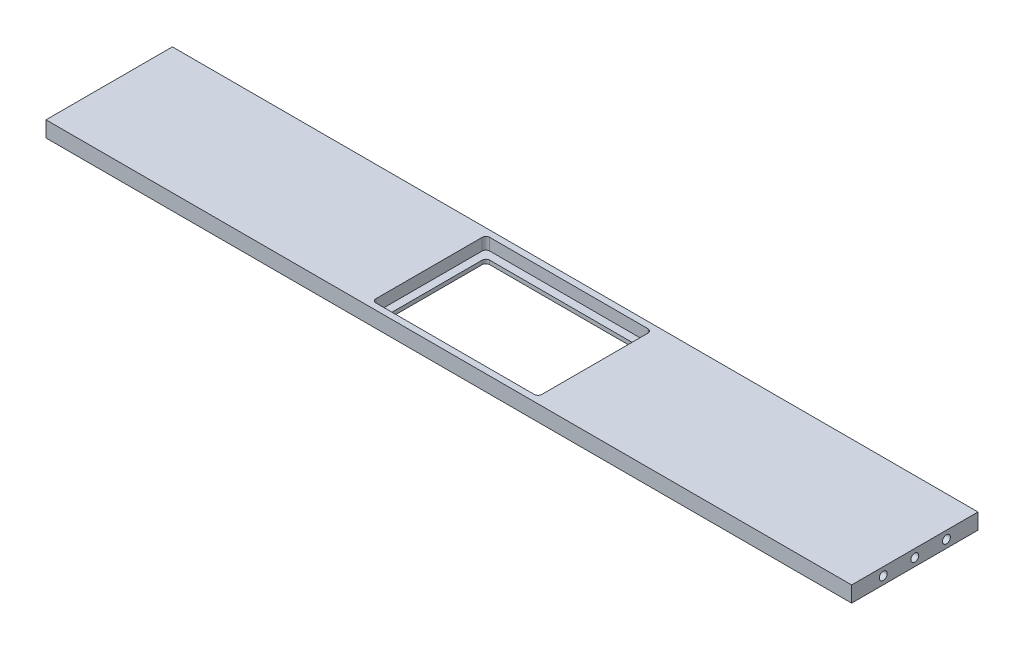
ISO-10303-21;
HEADER;
FILE_DESCRIPTION(('STEP AP214'),'2;1');
FILE_NAME('part.step','',(''),(''),'','','');
FILE_SCHEMA(('AUTOMOTIVE_DESIGN { 1 0 10303 214 1 1 1 1 }'));
ENDSEC;
DATA;
#1=APPLICATION_CONTEXT('core data for automotive mechanical design processes');
#2=APPLICATION_PROTOCOL_DEFINITION('international standard','automotive_design',2000,#1);
#3=PRODUCT_CONTEXT('',#1,'mechanical');
#4=PRODUCT('Part','Part','',(#3));
#5=PRODUCT_RELATED_PRODUCT_CATEGORY('part','',(#4));
#6=PRODUCT_DEFINITION_FORMATION('','',#4);
#7=PRODUCT_DEFINITION_CONTEXT('part definition',#1,'design');
#8=PRODUCT_DEFINITION('design','',#6,#7);
#9=PRODUCT_DEFINITION_SHAPE('','',#8);
#10=(LENGTH_UNIT() NAMED_UNIT(*) SI_UNIT(.MILLI.,.METRE.));
#11=(NAMED_UNIT(*) PLANE_ANGLE_UNIT() SI_UNIT($,.RADIAN.));
#12=(NAMED_UNIT(*) SI_UNIT($,.STERADIAN.) SOLID_ANGLE_UNIT());
#13=UNCERTAINTY_MEASURE_WITH_UNIT(LENGTH_MEASURE(1.E-05),#10,'distance_accuracy_value','');
#14=(GEOMETRIC_REPRESENTATION_CONTEXT(3) GLOBAL_UNCERTAINTY_ASSIGNED_CONTEXT((#13)) GLOBAL_UNIT_ASSIGNED_CONTEXT((#10,
#11,#12)) REPRESENTATION_CONTEXT('',''));
#15=CARTESIAN_POINT('',(0.,0.,0.));
#16=DIRECTION('',(0.,0.,1.));
#17=DIRECTION('',(1.,0.,0.));
#18=AXIS2_PLACEMENT_3D('',#15,#16,#17);
#19=CARTESIAN_POINT('',(-323.85,-12.7,50.8));
#20=DIRECTION('',(0.,1.,0.));
#21=DIRECTION('',(0.,0.,1.));
#22=AXIS2_PLACEMENT_3D('',#19,#20,#21);
#23=PLANE('',#22);
#24=DIRECTION('',(1.,0.,0.));
#25=VECTOR('',#24,1.);
#26=CARTESIAN_POINT('',(-323.85,-12.7,-50.8));
#27=LINE('',#26,#25);
#28=CARTESIAN_POINT('',(-323.85,-12.7,-50.8));
#29=VERTEX_POINT('',#28);
#30=CARTESIAN_POINT('',(323.85,-12.7,-50.8));
#31=VERTEX_POINT('',#30);
#32=EDGE_CURVE('E294',#29,#31,#27,.T.);
#33=ORIENTED_EDGE('',*,*,#32,.T.);
#34=DIRECTION('',(0.,0.,-1.));
#35=VECTOR('',#34,1.);
#36=CARTESIAN_POINT('',(323.85,-12.7,50.8));
#37=LINE('',#36,#35);
#38=CARTESIAN_POINT('',(323.85,-12.7,50.8));
#39=VERTEX_POINT('',#38);
#40=EDGE_CURVE('E363',#39,#31,#37,.T.);
#41=ORIENTED_EDGE('',*,*,#40,.F.);
#42=DIRECTION('',(1.,0.,0.));
#43=VECTOR('',#42,1.);
#44=CARTESIAN_POINT('',(-323.85,-12.7,50.8));
#45=LINE('',#44,#43);
#46=CARTESIAN_POINT('',(-323.85,-12.7,50.8));
#47=VERTEX_POINT('',#46);
#48=EDGE_CURVE('E337',#47,#39,#45,.T.);
#49=ORIENTED_EDGE('',*,*,#48,.F.);
#50=DIRECTION('',(0.,0.,-1.));
#51=VECTOR('',#50,1.);
#52=CARTESIAN_POINT('',(-323.85,-12.7,50.8));
#53=LINE('',#52,#51);
#54=EDGE_CURVE('E347',#47,#29,#53,.T.);
#55=ORIENTED_EDGE('',*,*,#54,.T.);
#56=EDGE_LOOP('',(#33,#41,#49,#55));
#57=FACE_BOUND('',#56,.T.);
#58=CARTESIAN_POINT('',(57.325,-12.7,36.37));
#59=DIRECTION('',(0.,-1.,0.));
#60=DIRECTION('',(0.,0.,-1.));
#61=AXIS2_PLACEMENT_3D('',#58,#59,#60);
#62=CIRCLE('',#61,3.);
#63=CARTESIAN_POINT('',(60.325,-12.7,36.37));
#64=VERTEX_POINT('',#63);
#65=CARTESIAN_POINT('',(57.325,-12.7,39.37));
#66=VERTEX_POINT('',#65);
#67=EDGE_CURVE('E188',#64,#66,#62,.T.);
#68=ORIENTED_EDGE('',*,*,#67,.F.);
#69=DIRECTION('',(0.,0.,1.));
#70=VECTOR('',#69,1.);
#71=CARTESIAN_POINT('',(60.325,-12.7,-36.37));
#72=LINE('',#71,#70);
#73=CARTESIAN_POINT('',(60.325,-12.7,-36.37));
#74=VERTEX_POINT('',#73);
#75=EDGE_CURVE('E221',#74,#64,#72,.T.);
#76=ORIENTED_EDGE('',*,*,#75,.F.);
#77=CARTESIAN_POINT('',(57.325,-12.7,-36.37));
#78=DIRECTION('',(0.,-1.,0.));
#79=DIRECTION('',(0.,0.,-1.));
#80=AXIS2_PLACEMENT_3D('',#77,#78,#79);
#81=CIRCLE('',#80,3.);
#82=CARTESIAN_POINT('',(57.325,-12.7,-39.37));
#83=VERTEX_POINT('',#82);
#84=EDGE_CURVE('E219',#83,#74,#81,.T.);
#85=ORIENTED_EDGE('',*,*,#84,.F.);
#86=DIRECTION('',(-1.,0.,0.));
#87=VECTOR('',#86,1.);
#88=CARTESIAN_POINT('',(57.325,-12.7,-39.37));
#89=LINE('',#88,#87);
#90=CARTESIAN_POINT('',(-57.325,-12.7,-39.37));
#91=VERTEX_POINT('',#90);
#92=EDGE_CURVE('E216',#83,#91,#89,.T.);
#93=ORIENTED_EDGE('',*,*,#92,.T.);
#94=CARTESIAN_POINT('',(-57.325,-12.7,-36.37));
#95=DIRECTION('',(0.,1.,0.));
#96=DIRECTION('',(0.,0.,1.));
#97=AXIS2_PLACEMENT_3D('',#94,#95,#96);
#98=CIRCLE('',#97,3.00000000000001);
#99=CARTESIAN_POINT('',(-60.325,-12.7,-36.37));
#100=VERTEX_POINT('',#99);
#101=EDGE_CURVE('E213',#91,#100,#98,.T.);
#102=ORIENTED_EDGE('',*,*,#101,.T.);
#103=DIRECTION('',(0.,0.,1.));
#104=VECTOR('',#103,1.);
#105=CARTESIAN_POINT('',(-60.325,-12.7,-36.37));
#106=LINE('',#105,#104);
#107=CARTESIAN_POINT('',(-60.325,-12.7,36.37));
#108=VERTEX_POINT('',#107);
#109=EDGE_CURVE('E209',#100,#108,#106,.T.);
#110=ORIENTED_EDGE('',*,*,#109,.T.);
#111=CARTESIAN_POINT('',(-57.325,-12.7,36.37));
#112=DIRECTION('',(0.,-1.,0.));
#113=DIRECTION('',(0.,0.,-1.));
#114=AXIS2_PLACEMENT_3D('',#111,#112,#113);
#115=CIRCLE('',#114,3.00000000000001);
#116=CARTESIAN_POINT('',(-57.325,-12.7,39.37));
#117=VERTEX_POINT('',#116);
#118=EDGE_CURVE('E207',#117,#108,#115,.T.);
#119=ORIENTED_EDGE('',*,*,#118,.F.);
#120=DIRECTION('',(-1.,0.,0.));
#121=VECTOR('',#120,1.);
#122=CARTESIAN_POINT('',(57.325,-12.7,39.37));
#123=LINE('',#122,#121);
#124=EDGE_CURVE('E195',#66,#117,#123,.T.);
#125=ORIENTED_EDGE('',*,*,#124,.F.);
#126=EDGE_LOOP('',(#68,#76,#85,#93,#102,#110,#119,#125));
#127=FACE_BOUND('',#126,.T.);
#128=ADVANCED_FACE('F35',(#57,#127),#23,.F.);
#129=CARTESIAN_POINT('',(-323.85,-9.52500000000004,50.8));
#130=DIRECTION('',(0.,1.,0.));
#131=DIRECTION('',(0.,0.,1.));
#132=AXIS2_PLACEMENT_3D('',#129,#130,#131);
#133=PLANE('',#132);
#134=DIRECTION('',(1.,0.,0.));
#135=VECTOR('',#134,1.);
#136=CARTESIAN_POINT('',(63.675,-9.52500000000003,45.72));
#137=LINE('',#136,#135);
#138=CARTESIAN_POINT('',(-63.675,-9.52500000000003,45.72));
#139=VERTEX_POINT('',#138);
#140=CARTESIAN_POINT('',(63.675,-9.52500000000003,45.72));
#141=VERTEX_POINT('',#140);
#142=EDGE_CURVE('E288',#139,#141,#137,.T.);
#143=ORIENTED_EDGE('',*,*,#142,.T.);
#144=CARTESIAN_POINT('',(63.675,-9.52500000000003,42.72));
#145=DIRECTION('',(0.,1.,0.));
#146=DIRECTION('',(0.,0.,1.));
#147=AXIS2_PLACEMENT_3D('',#144,#145,#146);
#148=CIRCLE('',#147,3.00000000000001);
#149=CARTESIAN_POINT('',(66.675,-9.52500000000003,42.72));
#150=VERTEX_POINT('',#149);
#151=EDGE_CURVE('E291',#141,#150,#148,.T.);
#152=ORIENTED_EDGE('',*,*,#151,.T.);
#153=DIRECTION('',(0.,0.,-1.));
#154=VECTOR('',#153,1.);
#155=CARTESIAN_POINT('',(66.675,-9.52500000000003,-42.72));
#156=LINE('',#155,#154);
#157=CARTESIAN_POINT('',(66.675,-9.52500000000003,-42.72));
#158=VERTEX_POINT('',#157);
#159=EDGE_CURVE('E278',#150,#158,#156,.T.);
#160=ORIENTED_EDGE('',*,*,#159,.T.);
#161=CARTESIAN_POINT('',(63.675,-9.52500000000003,-42.72));
#162=DIRECTION('',(0.,1.,0.));
#163=DIRECTION('',(0.,0.,1.));
#164=AXIS2_PLACEMENT_3D('',#161,#162,#163);
#165=CIRCLE('',#164,3.);
#166=CARTESIAN_POINT('',(63.675,-9.52500000000003,-45.72));
#167=VERTEX_POINT('',#166);
#168=EDGE_CURVE('E274',#158,#167,#165,.T.);
#169=ORIENTED_EDGE('',*,*,#168,.T.);
#170=DIRECTION('',(1.,0.,0.));
#171=VECTOR('',#170,1.);
#172=CARTESIAN_POINT('',(63.675,-9.52500000000003,-45.72));
#173=LINE('',#172,#171);
#174=CARTESIAN_POINT('',(-63.675,-9.52500000000003,-45.72));
#175=VERTEX_POINT('',#174);
#176=EDGE_CURVE('E277',#175,#167,#173,.T.);
#177=ORIENTED_EDGE('',*,*,#176,.F.);
#178=CARTESIAN_POINT('',(-63.675,-9.52500000000003,-42.72));
#179=DIRECTION('',(0.,1.,0.));
#180=DIRECTION('',(0.,0.,1.));
#181=AXIS2_PLACEMENT_3D('',#178,#179,#180);
#182=CIRCLE('',#181,3.);
#183=CARTESIAN_POINT('',(-66.675,-9.52500000000003,-42.72));
#184=VERTEX_POINT('',#183);
#185=EDGE_CURVE('E280',#175,#184,#182,.T.);
#186=ORIENTED_EDGE('',*,*,#185,.T.);
#187=DIRECTION('',(0.,0.,-1.));
#188=VECTOR('',#187,1.);
#189=CARTESIAN_POINT('',(-66.675,-9.52500000000003,-42.72));
#190=LINE('',#189,#188);
#191=CARTESIAN_POINT('',(-66.675,-9.52500000000003,42.72));
#192=VERTEX_POINT('',#191);
#193=EDGE_CURVE('E283',#192,#184,#190,.T.);
#194=ORIENTED_EDGE('',*,*,#193,.F.);
#195=CARTESIAN_POINT('',(-63.675,-9.52500000000003,42.72));
#196=DIRECTION('',(0.,1.,0.));
#197=DIRECTION('',(0.,0.,1.));
#198=AXIS2_PLACEMENT_3D('',#195,#196,#197);
#199=CIRCLE('',#198,3.);
#200=EDGE_CURVE('E285',#192,#139,#199,.T.);
#201=ORIENTED_EDGE('',*,*,#200,.T.);
#202=EDGE_LOOP('',(#143,#152,#160,#169,#177,#186,#194,#201));
#203=FACE_BOUND('',#202,.T.);
#204=DIRECTION('',(0.,0.,1.));
#205=VECTOR('',#204,1.);
#206=CARTESIAN_POINT('',(60.325,-9.52500000000004,50.8000000000001));
#207=LINE('',#206,#205);
#208=CARTESIAN_POINT('',(60.325,-9.52500000000004,-36.37));
#209=VERTEX_POINT('',#208);
#210=CARTESIAN_POINT('',(60.325,-9.52500000000004,36.37));
#211=VERTEX_POINT('',#210);
#212=EDGE_CURVE('E366',#209,#211,#207,.T.);
#213=ORIENTED_EDGE('',*,*,#212,.T.);
#214=CARTESIAN_POINT('',(57.325,-9.52500000000004,36.37));
#215=DIRECTION('',(0.,1.,0.));
#216=DIRECTION('',(0.,0.,1.));
#217=AXIS2_PLACEMENT_3D('',#214,#215,#216);
#218=CIRCLE('',#217,3.);
#219=CARTESIAN_POINT('',(57.325,-9.52500000000004,39.37));
#220=VERTEX_POINT('',#219);
#221=EDGE_CURVE('E12',#211,#220,#218,.F.);
#222=ORIENTED_EDGE('',*,*,#221,.T.);
#223=DIRECTION('',(-1.,0.,0.));
#224=VECTOR('',#223,1.);
#225=CARTESIAN_POINT('',(-323.85,-9.52500000000004,39.37));
#226=LINE('',#225,#224);
#227=CARTESIAN_POINT('',(-57.325,-9.52500000000004,39.37));
#228=VERTEX_POINT('',#227);
#229=EDGE_CURVE('E42',#220,#228,#226,.T.);
#230=ORIENTED_EDGE('',*,*,#229,.T.);
#231=CARTESIAN_POINT('',(-57.325,-9.52500000000004,36.37));
#232=DIRECTION('',(0.,1.,0.));
#233=DIRECTION('',(0.,0.,1.));
#234=AXIS2_PLACEMENT_3D('',#231,#232,#233);
#235=CIRCLE('',#234,3.00000000000001);
#236=CARTESIAN_POINT('',(-60.325,-9.52500000000004,36.37));
#237=VERTEX_POINT('',#236);
#238=EDGE_CURVE('E378',#228,#237,#235,.F.);
#239=ORIENTED_EDGE('',*,*,#238,.T.);
#240=DIRECTION('',(0.,0.,1.));
#241=VECTOR('',#240,1.);
#242=CARTESIAN_POINT('',(-60.325,-9.52500000000004,50.8));
#243=LINE('',#242,#241);
#244=CARTESIAN_POINT('',(-60.325,-9.52500000000004,-36.37));
#245=VERTEX_POINT('',#244);
#246=EDGE_CURVE('E376',#245,#237,#243,.T.);
#247=ORIENTED_EDGE('',*,*,#246,.F.);
#248=CARTESIAN_POINT('',(-57.325,-9.52500000000004,-36.37));
#249=DIRECTION('',(0.,1.,0.));
#250=DIRECTION('',(0.,0.,1.));
#251=AXIS2_PLACEMENT_3D('',#248,#249,#250);
#252=CIRCLE('',#251,3.00000000000001);
#253=CARTESIAN_POINT('',(-57.325,-9.52500000000004,-39.37));
#254=VERTEX_POINT('',#253);
#255=EDGE_CURVE('E374',#254,#245,#252,.T.);
#256=ORIENTED_EDGE('',*,*,#255,.F.);
#257=DIRECTION('',(-1.,0.,0.));
#258=VECTOR('',#257,1.);
#259=CARTESIAN_POINT('',(-323.85,-9.52500000000004,-39.37));
#260=LINE('',#259,#258);
#261=CARTESIAN_POINT('',(57.325,-9.52500000000004,-39.37));
#262=VERTEX_POINT('',#261);
#263=EDGE_CURVE('E372',#262,#254,#260,.T.);
#264=ORIENTED_EDGE('',*,*,#263,.F.);
#265=CARTESIAN_POINT('',(57.325,-9.52500000000004,-36.37));
#266=DIRECTION('',(0.,1.,0.));
#267=DIRECTION('',(0.,0.,1.));
#268=AXIS2_PLACEMENT_3D('',#265,#266,#267);
#269=CIRCLE('',#268,3.);
#270=EDGE_CURVE('E369',#262,#209,#269,.F.);
#271=ORIENTED_EDGE('',*,*,#270,.T.);
#272=EDGE_LOOP('',(#213,#222,#230,#239,#247,#256,#264,#271));
#273=FACE_BOUND('',#272,.T.);
#274=ADVANCED_FACE('F381',(#203,#273),#133,.T.);
#275=CARTESIAN_POINT('',(323.85,-12.7,50.8));
#276=DIRECTION('',(-1.,0.,0.));
#277=DIRECTION('',(0.,0.,1.));
#278=AXIS2_PLACEMENT_3D('',#275,#276,#277);
#279=PLANE('',#278);
#280=CARTESIAN_POINT('',(323.85,-6.35000000000002,-25.4));
#281=DIRECTION('',(1.,0.,0.));
#282=DIRECTION('',(0.,0.,-1.));
#283=AXIS2_PLACEMENT_3D('',#280,#281,#282);
#284=CIRCLE('',#283,3.17499999999999);
#285=CARTESIAN_POINT('',(323.85,-6.35000000000002,-28.575));
#286=VERTEX_POINT('',#285);
#287=EDGE_CURVE('E202',#286,#286,#284,.T.);
#288=ORIENTED_EDGE('',*,*,#287,.F.);
#289=EDGE_LOOP('',(#288));
#290=FACE_BOUND('',#289,.T.);
#291=CARTESIAN_POINT('',(323.85,-6.35000000000002,0.));
#292=DIRECTION('',(1.,0.,0.));
#293=DIRECTION('',(0.,0.,-1.));
#294=AXIS2_PLACEMENT_3D('',#291,#292,#293);
#295=CIRCLE('',#294,3.17499999999999);
#296=CARTESIAN_POINT('',(323.85,-6.35000000000002,-3.17499999999999));
#297=VERTEX_POINT('',#296);
#298=EDGE_CURVE('E243',#297,#297,#295,.T.);
#299=ORIENTED_EDGE('',*,*,#298,.F.);
#300=EDGE_LOOP('',(#299));
#301=FACE_BOUND('',#300,.T.);
#302=CARTESIAN_POINT('',(323.85,-6.35000000000002,25.4));
#303=DIRECTION('',(1.,0.,0.));
#304=DIRECTION('',(0.,0.,-1.));
#305=AXIS2_PLACEMENT_3D('',#302,#303,#304);
#306=CIRCLE('',#305,3.17499999999999);
#307=CARTESIAN_POINT('',(323.85,-6.35000000000002,22.225));
#308=VERTEX_POINT('',#307);
#309=EDGE_CURVE('E249',#308,#308,#306,.T.);
#310=ORIENTED_EDGE('',*,*,#309,.F.);
#311=EDGE_LOOP('',(#310));
#312=FACE_BOUND('',#311,.T.);
#313=DIRECTION('',(0.,1.,0.));
#314=VECTOR('',#313,1.);
#315=CARTESIAN_POINT('',(323.85,-12.7,-50.8));
#316=LINE('',#315,#314);
#317=CARTESIAN_POINT('',(323.85,0.,-50.8));
#318=VERTEX_POINT('',#317);
#319=EDGE_CURVE('E350',#31,#318,#316,.T.);
#320=ORIENTED_EDGE('',*,*,#319,.T.);
#321=DIRECTION('',(0.,0.,-1.));
#322=VECTOR('',#321,1.);
#323=CARTESIAN_POINT('',(323.85,0.,50.8));
#324=LINE('',#323,#322);
#325=CARTESIAN_POINT('',(323.85,0.,50.8));
#326=VERTEX_POINT('',#325);
#327=EDGE_CURVE('E360',#326,#318,#324,.T.);
#328=ORIENTED_EDGE('',*,*,#327,.F.);
#329=DIRECTION('',(0.,1.,0.));
#330=VECTOR('',#329,1.);
#331=CARTESIAN_POINT('',(323.85,-12.7,50.8));
#332=LINE('',#331,#330);
#333=EDGE_CURVE('E340',#39,#326,#332,.T.);
#334=ORIENTED_EDGE('',*,*,#333,.F.);
#335=ORIENTED_EDGE('',*,*,#40,.T.);
#336=EDGE_LOOP('',(#320,#328,#334,#335));
#337=FACE_BOUND('',#336,.T.);
#338=ADVANCED_FACE('F414',(#290,#301,#312,#337),#279,.F.);
#339=CARTESIAN_POINT('',(-323.85,0.,50.8));
#340=DIRECTION('',(0.,-1.,0.));
#341=DIRECTION('',(0.,0.,-1.));
#342=AXIS2_PLACEMENT_3D('',#339,#340,#341);
#343=PLANE('',#342);
#344=DIRECTION('',(0.,0.,1.));
#345=VECTOR('',#344,1.);
#346=CARTESIAN_POINT('',(66.675,0.,-42.72));
#347=LINE('',#346,#345);
#348=CARTESIAN_POINT('',(66.675,0.,-42.72));
#349=VERTEX_POINT('',#348);
#350=CARTESIAN_POINT('',(66.675,0.,42.72));
#351=VERTEX_POINT('',#350);
#352=EDGE_CURVE('E315',#349,#351,#347,.T.);
#353=ORIENTED_EDGE('',*,*,#352,.T.);
#354=CARTESIAN_POINT('',(63.675,0.,42.72));
#355=DIRECTION('',(0.,-1.,0.));
#356=DIRECTION('',(0.,0.,-1.));
#357=AXIS2_PLACEMENT_3D('',#354,#355,#356);
#358=CIRCLE('',#357,3.00000000000001);
#359=CARTESIAN_POINT('',(63.675,0.,45.72));
#360=VERTEX_POINT('',#359);
#361=EDGE_CURVE('E273',#351,#360,#358,.T.);
#362=ORIENTED_EDGE('',*,*,#361,.T.);
#363=DIRECTION('',(-1.,0.,0.));
#364=VECTOR('',#363,1.);
#365=CARTESIAN_POINT('',(63.675,0.,45.72));
#366=LINE('',#365,#364);
#367=CARTESIAN_POINT('',(-63.675,0.,45.72));
#368=VERTEX_POINT('',#367);
#369=EDGE_CURVE('E297',#360,#368,#366,.T.);
#370=ORIENTED_EDGE('',*,*,#369,.T.);
#371=CARTESIAN_POINT('',(-63.675,0.,42.72));
#372=DIRECTION('',(0.,-1.,0.));
#373=DIRECTION('',(0.,0.,-1.));
#374=AXIS2_PLACEMENT_3D('',#371,#372,#373);
#375=CIRCLE('',#374,3.);
#376=CARTESIAN_POINT('',(-66.675,0.,42.72));
#377=VERTEX_POINT('',#376);
#378=EDGE_CURVE('E300',#368,#377,#375,.T.);
#379=ORIENTED_EDGE('',*,*,#378,.T.);
#380=DIRECTION('',(0.,0.,1.));
#381=VECTOR('',#380,1.);
#382=CARTESIAN_POINT('',(-66.675,0.,-42.72));
#383=LINE('',#382,#381);
#384=CARTESIAN_POINT('',(-66.675,0.,-42.72));
#385=VERTEX_POINT('',#384);
#386=EDGE_CURVE('E303',#385,#377,#383,.T.);
#387=ORIENTED_EDGE('',*,*,#386,.F.);
#388=CARTESIAN_POINT('',(-63.675,0.,-42.72));
#389=DIRECTION('',(0.,-1.,0.));
#390=DIRECTION('',(0.,0.,-1.));
#391=AXIS2_PLACEMENT_3D('',#388,#389,#390);
#392=CIRCLE('',#391,3.);
#393=CARTESIAN_POINT('',(-63.675,0.,-45.72));
#394=VERTEX_POINT('',#393);
#395=EDGE_CURVE('E306',#385,#394,#392,.T.);
#396=ORIENTED_EDGE('',*,*,#395,.T.);
#397=DIRECTION('',(-1.,0.,0.));
#398=VECTOR('',#397,1.);
#399=CARTESIAN_POINT('',(63.675,0.,-45.72));
#400=LINE('',#399,#398);
#401=CARTESIAN_POINT('',(63.675,0.,-45.72));
#402=VERTEX_POINT('',#401);
#403=EDGE_CURVE('E309',#402,#394,#400,.T.);
#404=ORIENTED_EDGE('',*,*,#403,.F.);
#405=CARTESIAN_POINT('',(63.675,0.,-42.72));
#406=DIRECTION('',(0.,-1.,0.));
#407=DIRECTION('',(0.,0.,-1.));
#408=AXIS2_PLACEMENT_3D('',#405,#406,#407);
#409=CIRCLE('',#408,3.);
#410=EDGE_CURVE('E312',#402,#349,#409,.T.);
#411=ORIENTED_EDGE('',*,*,#410,.T.);
#412=EDGE_LOOP('',(#353,#362,#370,#379,#387,#396,#404,#411));
#413=FACE_BOUND('',#412,.T.);
#414=DIRECTION('',(-1.,0.,0.));
#415=VECTOR('',#414,1.);
#416=CARTESIAN_POINT('',(-323.85,0.,-50.8));
#417=LINE('',#416,#415);
#418=CARTESIAN_POINT('',(-323.85,0.,-50.8));
#419=VERTEX_POINT('',#418);
#420=EDGE_CURVE('E352',#318,#419,#417,.T.);
#421=ORIENTED_EDGE('',*,*,#420,.T.);
#422=DIRECTION('',(0.,0.,-1.));
#423=VECTOR('',#422,1.);
#424=CARTESIAN_POINT('',(-323.85,0.,50.8));
#425=LINE('',#424,#423);
#426=CARTESIAN_POINT('',(-323.85,0.,50.8));
#427=VERTEX_POINT('',#426);
#428=EDGE_CURVE('E357',#427,#419,#425,.T.);
#429=ORIENTED_EDGE('',*,*,#428,.F.);
#430=DIRECTION('',(-1.,0.,0.));
#431=VECTOR('',#430,1.);
#432=CARTESIAN_POINT('',(-323.85,0.,50.8));
#433=LINE('',#432,#431);
#434=EDGE_CURVE('E343',#326,#427,#433,.T.);
#435=ORIENTED_EDGE('',*,*,#434,.F.);
#436=ORIENTED_EDGE('',*,*,#327,.T.);
#437=EDGE_LOOP('',(#421,#429,#435,#436));
#438=FACE_BOUND('',#437,.T.);
#439=ADVANCED_FACE('F435',(#413,#438),#343,.F.);
#440=CARTESIAN_POINT('',(-323.85,-12.7,50.8));
#441=DIRECTION('',(1.,0.,0.));
#442=DIRECTION('',(0.,0.,-1.));
#443=AXIS2_PLACEMENT_3D('',#440,#441,#442);
#444=PLANE('',#443);
#445=CARTESIAN_POINT('',(-323.85,-6.35000000000002,-25.4));
#446=DIRECTION('',(-1.,0.,0.));
#447=DIRECTION('',(0.,0.,1.));
#448=AXIS2_PLACEMENT_3D('',#445,#446,#447);
#449=CIRCLE('',#448,3.17499999999999);
#450=CARTESIAN_POINT('',(-323.85,-6.35000000000002,-22.225));
#451=VERTEX_POINT('',#450);
#452=EDGE_CURVE('E255',#451,#451,#449,.T.);
#453=ORIENTED_EDGE('',*,*,#452,.F.);
#454=EDGE_LOOP('',(#453));
#455=FACE_BOUND('',#454,.T.);
#456=CARTESIAN_POINT('',(-323.85,-6.35000000000002,0.));
#457=DIRECTION('',(-1.,0.,0.));
#458=DIRECTION('',(0.,0.,1.));
#459=AXIS2_PLACEMENT_3D('',#456,#457,#458);
#460=CIRCLE('',#459,3.17499999999999);
#461=CARTESIAN_POINT('',(-323.85,-6.35000000000002,3.17499999999999));
#462=VERTEX_POINT('',#461);
#463=EDGE_CURVE('E261',#462,#462,#460,.T.);
#464=ORIENTED_EDGE('',*,*,#463,.F.);
#465=EDGE_LOOP('',(#464));
#466=FACE_BOUND('',#465,.T.);
#467=CARTESIAN_POINT('',(-323.85,-6.35000000000002,25.4));
#468=DIRECTION('',(-1.,0.,0.));
#469=DIRECTION('',(0.,0.,1.));
#470=AXIS2_PLACEMENT_3D('',#467,#468,#469);
#471=CIRCLE('',#470,3.17499999999999);
#472=CARTESIAN_POINT('',(-323.85,-6.35000000000002,28.575));
#473=VERTEX_POINT('',#472);
#474=EDGE_CURVE('E267',#473,#473,#471,.T.);
#475=ORIENTED_EDGE('',*,*,#474,.F.);
#476=EDGE_LOOP('',(#475));
#477=FACE_BOUND('',#476,.T.);
#478=DIRECTION('',(0.,-1.,0.));
#479=VECTOR('',#478,1.);
#480=CARTESIAN_POINT('',(-323.85,-12.7,-50.8));
#481=LINE('',#480,#479);
#482=EDGE_CURVE('E341',#419,#29,#481,.T.);
#483=ORIENTED_EDGE('',*,*,#482,.T.);
#484=ORIENTED_EDGE('',*,*,#54,.F.);
#485=DIRECTION('',(0.,-1.,0.));
#486=VECTOR('',#485,1.);
#487=CARTESIAN_POINT('',(-323.85,-12.7,50.8));
#488=LINE('',#487,#486);
#489=EDGE_CURVE('E345',#427,#47,#488,.T.);
#490=ORIENTED_EDGE('',*,*,#489,.F.);
#491=ORIENTED_EDGE('',*,*,#428,.T.);
#492=EDGE_LOOP('',(#483,#484,#490,#491));
#493=FACE_BOUND('',#492,.T.);
#494=ADVANCED_FACE('F433',(#455,#466,#477,#493),#444,.F.);
#495=CARTESIAN_POINT('',(0.,0.,50.8));
#496=DIRECTION('',(0.,0.,1.));
#497=DIRECTION('',(1.,0.,0.));
#498=AXIS2_PLACEMENT_3D('',#495,#496,#497);
#499=PLANE('',#498);
#500=ORIENTED_EDGE('',*,*,#48,.T.);
#501=ORIENTED_EDGE('',*,*,#333,.T.);
#502=ORIENTED_EDGE('',*,*,#434,.T.);
#503=ORIENTED_EDGE('',*,*,#489,.T.);
#504=EDGE_LOOP('',(#500,#501,#502,#503));
#505=FACE_BOUND('',#504,.T.);
#506=ADVANCED_FACE('F429',(#505),#499,.T.);
#507=CARTESIAN_POINT('',(0.,0.,-50.8));
#508=DIRECTION('',(0.,0.,1.));
#509=DIRECTION('',(1.,0.,0.));
#510=AXIS2_PLACEMENT_3D('',#507,#508,#509);
#511=PLANE('',#510);
#512=ORIENTED_EDGE('',*,*,#32,.F.);
#513=ORIENTED_EDGE('',*,*,#482,.F.);
#514=ORIENTED_EDGE('',*,*,#420,.F.);
#515=ORIENTED_EDGE('',*,*,#319,.F.);
#516=EDGE_LOOP('',(#512,#513,#514,#515));
#517=FACE_BOUND('',#516,.T.);
#518=ADVANCED_FACE('F423',(#517),#511,.F.);
#519=CARTESIAN_POINT('',(66.675,-174.389505225293,-42.72));
#520=DIRECTION('',(-1.,0.,0.));
#521=DIRECTION('',(0.,0.,1.));
#522=AXIS2_PLACEMENT_3D('',#519,#520,#521);
#523=PLANE('',#522);
#524=DIRECTION('',(0.,1.,0.));
#525=VECTOR('',#524,1.);
#526=CARTESIAN_POINT('',(66.675,-174.389505225293,42.72));
#527=LINE('',#526,#525);
#528=EDGE_CURVE('E318',#150,#351,#527,.T.);
#529=ORIENTED_EDGE('',*,*,#528,.T.);
#530=ORIENTED_EDGE('',*,*,#352,.F.);
#531=DIRECTION('',(0.,1.,0.));
#532=VECTOR('',#531,1.);
#533=CARTESIAN_POINT('',(66.675,-174.389505225293,-42.72));
#534=LINE('',#533,#532);
#535=EDGE_CURVE('E320',#158,#349,#534,.T.);
#536=ORIENTED_EDGE('',*,*,#535,.F.);
#537=ORIENTED_EDGE('',*,*,#159,.F.);
#538=EDGE_LOOP('',(#529,#530,#536,#537));
#539=FACE_BOUND('',#538,.T.);
#540=ADVANCED_FACE('F449',(#539),#523,.T.);
#541=CARTESIAN_POINT('',(63.675,-174.389505225293,-42.72));
#542=DIRECTION('',(0.,1.,0.));
#543=DIRECTION('',(0.,0.,1.));
#544=AXIS2_PLACEMENT_3D('',#541,#542,#543);
#545=CYLINDRICAL_SURFACE('',#544,3.);
#546=ORIENTED_EDGE('',*,*,#535,.T.);
#547=ORIENTED_EDGE('',*,*,#410,.F.);
#548=DIRECTION('',(0.,1.,0.));
#549=VECTOR('',#548,1.);
#550=CARTESIAN_POINT('',(63.675,-174.389505225293,-45.72));
#551=LINE('',#550,#549);
#552=EDGE_CURVE('E322',#167,#402,#551,.T.);
#553=ORIENTED_EDGE('',*,*,#552,.F.);
#554=ORIENTED_EDGE('',*,*,#168,.F.);
#555=EDGE_LOOP('',(#546,#547,#553,#554));
#556=FACE_BOUND('',#555,.T.);
#557=ADVANCED_FACE('F476',(#556),#545,.F.);
#558=CARTESIAN_POINT('',(63.675,-174.389505225293,-45.72));
#559=DIRECTION('',(0.,0.,-1.));
#560=DIRECTION('',(-1.,0.,0.));
#561=AXIS2_PLACEMENT_3D('',#558,#559,#560);
#562=PLANE('',#561);
#563=ORIENTED_EDGE('',*,*,#176,.T.);
#564=ORIENTED_EDGE('',*,*,#552,.T.);
#565=ORIENTED_EDGE('',*,*,#403,.T.);
#566=DIRECTION('',(0.,1.,0.));
#567=VECTOR('',#566,1.);
#568=CARTESIAN_POINT('',(-63.675,-174.389505225293,-45.72));
#569=LINE('',#568,#567);
#570=EDGE_CURVE('E324',#175,#394,#569,.T.);
#571=ORIENTED_EDGE('',*,*,#570,.F.);
#572=EDGE_LOOP('',(#563,#564,#565,#571));
#573=FACE_BOUND('',#572,.T.);
#574=ADVANCED_FACE('F472',(#573),#562,.F.);
#575=CARTESIAN_POINT('',(-63.675,-174.389505225293,-42.72));
#576=DIRECTION('',(0.,1.,0.));
#577=DIRECTION('',(0.,0.,1.));
#578=AXIS2_PLACEMENT_3D('',#575,#576,#577);
#579=CYLINDRICAL_SURFACE('',#578,3.);
#580=ORIENTED_EDGE('',*,*,#570,.T.);
#581=ORIENTED_EDGE('',*,*,#395,.F.);
#582=DIRECTION('',(0.,1.,0.));
#583=VECTOR('',#582,1.);
#584=CARTESIAN_POINT('',(-66.675,-174.389505225293,-42.72));
#585=LINE('',#584,#583);
#586=EDGE_CURVE('E326',#184,#385,#585,.T.);
#587=ORIENTED_EDGE('',*,*,#586,.F.);
#588=ORIENTED_EDGE('',*,*,#185,.F.);
#589=EDGE_LOOP('',(#580,#581,#587,#588));
#590=FACE_BOUND('',#589,.T.);
#591=ADVANCED_FACE('F468',(#590),#579,.F.);
#592=CARTESIAN_POINT('',(-66.675,-174.389505225293,-42.72));
#593=DIRECTION('',(-1.,0.,0.));
#594=DIRECTION('',(0.,0.,1.));
#595=AXIS2_PLACEMENT_3D('',#592,#593,#594);
#596=PLANE('',#595);
#597=ORIENTED_EDGE('',*,*,#193,.T.);
#598=ORIENTED_EDGE('',*,*,#586,.T.);
#599=ORIENTED_EDGE('',*,*,#386,.T.);
#600=DIRECTION('',(0.,1.,0.));
#601=VECTOR('',#600,1.);
#602=CARTESIAN_POINT('',(-66.675,-174.389505225293,42.72));
#603=LINE('',#602,#601);
#604=EDGE_CURVE('E328',#192,#377,#603,.T.);
#605=ORIENTED_EDGE('',*,*,#604,.F.);
#606=EDGE_LOOP('',(#597,#598,#599,#605));
#607=FACE_BOUND('',#606,.T.);
#608=ADVANCED_FACE('F464',(#607),#596,.F.);
#609=CARTESIAN_POINT('',(-63.675,-174.389505225293,42.72));
#610=DIRECTION('',(0.,1.,0.));
#611=DIRECTION('',(0.,0.,1.));
#612=AXIS2_PLACEMENT_3D('',#609,#610,#611);
#613=CYLINDRICAL_SURFACE('',#612,3.);
#614=ORIENTED_EDGE('',*,*,#604,.T.);
#615=ORIENTED_EDGE('',*,*,#378,.F.);
#616=DIRECTION('',(0.,1.,0.));
#617=VECTOR('',#616,1.);
#618=CARTESIAN_POINT('',(-63.675,-174.389505225293,45.72));
#619=LINE('',#618,#617);
#620=EDGE_CURVE('E330',#139,#368,#619,.T.);
#621=ORIENTED_EDGE('',*,*,#620,.F.);
#622=ORIENTED_EDGE('',*,*,#200,.F.);
#623=EDGE_LOOP('',(#614,#615,#621,#622));
#624=FACE_BOUND('',#623,.T.);
#625=ADVANCED_FACE('F460',(#624),#613,.F.);
#626=CARTESIAN_POINT('',(63.675,-174.389505225293,45.72));
#627=DIRECTION('',(0.,0.,-1.));
#628=DIRECTION('',(-1.,0.,0.));
#629=AXIS2_PLACEMENT_3D('',#626,#627,#628);
#630=PLANE('',#629);
#631=ORIENTED_EDGE('',*,*,#620,.T.);
#632=ORIENTED_EDGE('',*,*,#369,.F.);
#633=DIRECTION('',(0.,1.,0.));
#634=VECTOR('',#633,1.);
#635=CARTESIAN_POINT('',(63.675,-174.389505225293,45.72));
#636=LINE('',#635,#634);
#637=EDGE_CURVE('E332',#141,#360,#636,.T.);
#638=ORIENTED_EDGE('',*,*,#637,.F.);
#639=ORIENTED_EDGE('',*,*,#142,.F.);
#640=EDGE_LOOP('',(#631,#632,#638,#639));
#641=FACE_BOUND('',#640,.T.);
#642=ADVANCED_FACE('F456',(#641),#630,.T.);
#643=CARTESIAN_POINT('',(63.675,-174.389505225293,42.72));
#644=DIRECTION('',(0.,1.,0.));
#645=DIRECTION('',(0.,0.,1.));
#646=AXIS2_PLACEMENT_3D('',#643,#644,#645);
#647=CYLINDRICAL_SURFACE('',#646,3.00000000000001);
#648=ORIENTED_EDGE('',*,*,#637,.T.);
#649=ORIENTED_EDGE('',*,*,#361,.F.);
#650=ORIENTED_EDGE('',*,*,#528,.F.);
#651=ORIENTED_EDGE('',*,*,#151,.F.);
#652=EDGE_LOOP('',(#648,#649,#650,#651));
#653=FACE_BOUND('',#652,.T.);
#654=ADVANCED_FACE('F452',(#653),#647,.F.);
#655=CARTESIAN_POINT('',(-273.05,-6.35000000000002,25.4));
#656=DIRECTION('',(-1.,0.,0.));
#657=DIRECTION('',(0.,0.,1.));
#658=AXIS2_PLACEMENT_3D('',#655,#656,#657);
#659=CONICAL_SURFACE('',#658,3.17499999999999,1.02974425867666);
#660=CARTESIAN_POINT('',(-271.142267534587,-6.35000000000004,25.4));
#661=VERTEX_POINT('',#660);
#662=VERTEX_LOOP('',#661);
#663=FACE_BOUND('',#662,.T.);
#664=CARTESIAN_POINT('',(-273.05,-6.35000000000002,25.4));
#665=DIRECTION('',(-1.,0.,0.));
#666=DIRECTION('',(0.,0.,1.));
#667=AXIS2_PLACEMENT_3D('',#664,#665,#666);
#668=CIRCLE('',#667,3.17499999999999);
#669=CARTESIAN_POINT('',(-273.05,-6.35000000000002,28.575));
#670=VERTEX_POINT('',#669);
#671=EDGE_CURVE('E270',#670,#670,#668,.T.);
#672=ORIENTED_EDGE('',*,*,#671,.T.);
#673=EDGE_LOOP('',(#672));
#674=FACE_BOUND('',#673,.T.);
#675=ADVANCED_FACE('F455',(#663,#674),#659,.F.);
#676=CARTESIAN_POINT('',(-323.85,-6.35000000000002,25.4));
#677=DIRECTION('',(-1.,0.,0.));
#678=DIRECTION('',(0.,0.,1.));
#679=AXIS2_PLACEMENT_3D('',#676,#677,#678);
#680=CYLINDRICAL_SURFACE('',#679,3.17499999999999);
#681=ORIENTED_EDGE('',*,*,#671,.F.);
#682=EDGE_LOOP('',(#681));
#683=FACE_BOUND('',#682,.T.);
#684=ORIENTED_EDGE('',*,*,#474,.T.);
#685=EDGE_LOOP('',(#684));
#686=FACE_BOUND('',#685,.T.);
#687=ADVANCED_FACE('F486',(#683,#686),#680,.F.);
#688=CARTESIAN_POINT('',(-273.05,-6.35000000000002,0.));
#689=DIRECTION('',(-1.,0.,0.));
#690=DIRECTION('',(0.,0.,1.));
#691=AXIS2_PLACEMENT_3D('',#688,#689,#690);
#692=CONICAL_SURFACE('',#691,3.17499999999999,1.02974425867666);
#693=CARTESIAN_POINT('',(-271.142267534587,-6.35000000000004,0.));
#694=VERTEX_POINT('',#693);
#695=VERTEX_LOOP('',#694);
#696=FACE_BOUND('',#695,.T.);
#697=CARTESIAN_POINT('',(-273.05,-6.35000000000002,0.));
#698=DIRECTION('',(-1.,0.,0.));
#699=DIRECTION('',(0.,0.,1.));
#700=AXIS2_PLACEMENT_3D('',#697,#698,#699);
#701=CIRCLE('',#700,3.17499999999999);
#702=CARTESIAN_POINT('',(-273.05,-6.35000000000002,3.17499999999999));
#703=VERTEX_POINT('',#702);
#704=EDGE_CURVE('E264',#703,#703,#701,.T.);
#705=ORIENTED_EDGE('',*,*,#704,.T.);
#706=EDGE_LOOP('',(#705));
#707=FACE_BOUND('',#706,.T.);
#708=ADVANCED_FACE('F490',(#696,#707),#692,.F.);
#709=CARTESIAN_POINT('',(-323.85,-6.35000000000002,0.));
#710=DIRECTION('',(-1.,0.,0.));
#711=DIRECTION('',(0.,0.,1.));
#712=AXIS2_PLACEMENT_3D('',#709,#710,#711);
#713=CYLINDRICAL_SURFACE('',#712,3.17499999999999);
#714=ORIENTED_EDGE('',*,*,#704,.F.);
#715=EDGE_LOOP('',(#714));
#716=FACE_BOUND('',#715,.T.);
#717=ORIENTED_EDGE('',*,*,#463,.T.);
#718=EDGE_LOOP('',(#717));
#719=FACE_BOUND('',#718,.T.);
#720=ADVANCED_FACE('F494',(#716,#719),#713,.F.);
#721=CARTESIAN_POINT('',(-273.05,-6.35000000000002,-25.4));
#722=DIRECTION('',(-1.,0.,0.));
#723=DIRECTION('',(0.,0.,1.));
#724=AXIS2_PLACEMENT_3D('',#721,#722,#723);
#725=CONICAL_SURFACE('',#724,3.17499999999999,1.02974425867666);
#726=CARTESIAN_POINT('',(-271.142267534587,-6.35000000000004,-25.4));
#727=VERTEX_POINT('',#726);
#728=VERTEX_LOOP('',#727);
#729=FACE_BOUND('',#728,.T.);
#730=CARTESIAN_POINT('',(-273.05,-6.35000000000002,-25.4));
#731=DIRECTION('',(-1.,0.,0.));
#732=DIRECTION('',(0.,0.,1.));
#733=AXIS2_PLACEMENT_3D('',#730,#731,#732);
#734=CIRCLE('',#733,3.17499999999999);
#735=CARTESIAN_POINT('',(-273.05,-6.35000000000002,-22.225));
#736=VERTEX_POINT('',#735);
#737=EDGE_CURVE('E258',#736,#736,#734,.T.);
#738=ORIENTED_EDGE('',*,*,#737,.T.);
#739=EDGE_LOOP('',(#738));
#740=FACE_BOUND('',#739,.T.);
#741=ADVANCED_FACE('F498',(#729,#740),#725,.F.);
#742=CARTESIAN_POINT('',(-323.85,-6.35000000000002,-25.4));
#743=DIRECTION('',(-1.,0.,0.));
#744=DIRECTION('',(0.,0.,1.));
#745=AXIS2_PLACEMENT_3D('',#742,#743,#744);
#746=CYLINDRICAL_SURFACE('',#745,3.17499999999999);
#747=ORIENTED_EDGE('',*,*,#737,.F.);
#748=EDGE_LOOP('',(#747));
#749=FACE_BOUND('',#748,.T.);
#750=ORIENTED_EDGE('',*,*,#452,.T.);
#751=EDGE_LOOP('',(#750));
#752=FACE_BOUND('',#751,.T.);
#753=ADVANCED_FACE('F502',(#749,#752),#746,.F.);
#754=CARTESIAN_POINT('',(273.05,-6.35000000000002,25.4));
#755=DIRECTION('',(1.,0.,0.));
#756=DIRECTION('',(0.,0.,-1.));
#757=AXIS2_PLACEMENT_3D('',#754,#755,#756);
#758=CONICAL_SURFACE('',#757,3.17499999999999,1.02974425867666);
#759=CARTESIAN_POINT('',(271.142267534587,-6.35000000000004,25.4));
#760=VERTEX_POINT('',#759);
#761=VERTEX_LOOP('',#760);
#762=FACE_BOUND('',#761,.T.);
#763=CARTESIAN_POINT('',(273.05,-6.35000000000002,25.4));
#764=DIRECTION('',(1.,0.,0.));
#765=DIRECTION('',(0.,0.,-1.));
#766=AXIS2_PLACEMENT_3D('',#763,#764,#765);
#767=CIRCLE('',#766,3.17499999999999);
#768=CARTESIAN_POINT('',(273.05,-6.35000000000002,22.225));
#769=VERTEX_POINT('',#768);
#770=EDGE_CURVE('E252',#769,#769,#767,.T.);
#771=ORIENTED_EDGE('',*,*,#770,.T.);
#772=EDGE_LOOP('',(#771));
#773=FACE_BOUND('',#772,.T.);
#774=ADVANCED_FACE('F506',(#762,#773),#758,.F.);
#775=CARTESIAN_POINT('',(323.85,-6.35000000000002,25.4));
#776=DIRECTION('',(1.,0.,0.));
#777=DIRECTION('',(0.,0.,-1.));
#778=AXIS2_PLACEMENT_3D('',#775,#776,#777);
#779=CYLINDRICAL_SURFACE('',#778,3.17499999999999);
#780=ORIENTED_EDGE('',*,*,#770,.F.);
#781=EDGE_LOOP('',(#780));
#782=FACE_BOUND('',#781,.T.);
#783=ORIENTED_EDGE('',*,*,#309,.T.);
#784=EDGE_LOOP('',(#783));
#785=FACE_BOUND('',#784,.T.);
#786=ADVANCED_FACE('F510',(#782,#785),#779,.F.);
#787=CARTESIAN_POINT('',(273.05,-6.35000000000002,0.));
#788=DIRECTION('',(1.,0.,0.));
#789=DIRECTION('',(0.,0.,-1.));
#790=AXIS2_PLACEMENT_3D('',#787,#788,#789);
#791=CONICAL_SURFACE('',#790,3.17499999999999,1.02974425867666);
#792=CARTESIAN_POINT('',(271.142267534587,-6.35000000000004,0.));
#793=VERTEX_POINT('',#792);
#794=VERTEX_LOOP('',#793);
#795=FACE_BOUND('',#794,.T.);
#796=CARTESIAN_POINT('',(273.05,-6.35000000000002,0.));
#797=DIRECTION('',(1.,0.,0.));
#798=DIRECTION('',(0.,0.,-1.));
#799=AXIS2_PLACEMENT_3D('',#796,#797,#798);
#800=CIRCLE('',#799,3.17499999999999);
#801=CARTESIAN_POINT('',(273.05,-6.35000000000002,-3.17499999999999));
#802=VERTEX_POINT('',#801);
#803=EDGE_CURVE('E246',#802,#802,#800,.T.);
#804=ORIENTED_EDGE('',*,*,#803,.T.);
#805=EDGE_LOOP('',(#804));
#806=FACE_BOUND('',#805,.T.);
#807=ADVANCED_FACE('F514',(#795,#806),#791,.F.);
#808=CARTESIAN_POINT('',(323.85,-6.35000000000002,0.));
#809=DIRECTION('',(1.,0.,0.));
#810=DIRECTION('',(0.,0.,-1.));
#811=AXIS2_PLACEMENT_3D('',#808,#809,#810);
#812=CYLINDRICAL_SURFACE('',#811,3.17499999999999);
#813=ORIENTED_EDGE('',*,*,#803,.F.);
#814=EDGE_LOOP('',(#813));
#815=FACE_BOUND('',#814,.T.);
#816=ORIENTED_EDGE('',*,*,#298,.T.);
#817=EDGE_LOOP('',(#816));
#818=FACE_BOUND('',#817,.T.);
#819=ADVANCED_FACE('F518',(#815,#818),#812,.F.);
#820=CARTESIAN_POINT('',(273.05,-6.35000000000002,-25.4));
#821=DIRECTION('',(1.,0.,0.));
#822=DIRECTION('',(0.,0.,-1.));
#823=AXIS2_PLACEMENT_3D('',#820,#821,#822);
#824=CONICAL_SURFACE('',#823,3.17499999999999,1.02974425867666);
#825=CARTESIAN_POINT('',(271.142267534587,-6.35000000000004,-25.4));
#826=VERTEX_POINT('',#825);
#827=VERTEX_LOOP('',#826);
#828=FACE_BOUND('',#827,.T.);
#829=CARTESIAN_POINT('',(273.05,-6.35000000000002,-25.4));
#830=DIRECTION('',(1.,0.,0.));
#831=DIRECTION('',(0.,0.,-1.));
#832=AXIS2_PLACEMENT_3D('',#829,#830,#831);
#833=CIRCLE('',#832,3.17499999999999);
#834=CARTESIAN_POINT('',(273.05,-6.35000000000002,-28.575));
#835=VERTEX_POINT('',#834);
#836=EDGE_CURVE('E240',#835,#835,#833,.T.);
#837=ORIENTED_EDGE('',*,*,#836,.T.);
#838=EDGE_LOOP('',(#837));
#839=FACE_BOUND('',#838,.T.);
#840=ADVANCED_FACE('F522',(#828,#839),#824,.F.);
#841=CARTESIAN_POINT('',(323.85,-6.35000000000002,-25.4));
#842=DIRECTION('',(1.,0.,0.));
#843=DIRECTION('',(0.,0.,-1.));
#844=AXIS2_PLACEMENT_3D('',#841,#842,#843);
#845=CYLINDRICAL_SURFACE('',#844,3.17499999999999);
#846=ORIENTED_EDGE('',*,*,#836,.F.);
#847=EDGE_LOOP('',(#846));
#848=FACE_BOUND('',#847,.T.);
#849=ORIENTED_EDGE('',*,*,#287,.T.);
#850=EDGE_LOOP('',(#849));
#851=FACE_BOUND('',#850,.T.);
#852=ADVANCED_FACE('F526',(#848,#851),#845,.F.);
#853=CARTESIAN_POINT('',(57.325,-12.7,36.37));
#854=DIRECTION('',(0.,1.,0.));
#855=DIRECTION('',(0.,0.,1.));
#856=AXIS2_PLACEMENT_3D('',#853,#854,#855);
#857=CYLINDRICAL_SURFACE('',#856,3.);
#858=DIRECTION('',(0.,1.,0.));
#859=VECTOR('',#858,1.);
#860=CARTESIAN_POINT('',(60.325,-12.7,36.37));
#861=LINE('',#860,#859);
#862=EDGE_CURVE('E54',#64,#211,#861,.T.);
#863=ORIENTED_EDGE('',*,*,#862,.F.);
#864=ORIENTED_EDGE('',*,*,#67,.T.);
#865=DIRECTION('',(0.,1.,0.));
#866=VECTOR('',#865,1.);
#867=CARTESIAN_POINT('',(57.325,-12.7,39.37));
#868=LINE('',#867,#866);
#869=EDGE_CURVE('E191',#66,#220,#868,.T.);
#870=ORIENTED_EDGE('',*,*,#869,.T.);
#871=ORIENTED_EDGE('',*,*,#221,.F.);
#872=EDGE_LOOP('',(#863,#864,#870,#871));
#873=FACE_BOUND('',#872,.T.);
#874=ADVANCED_FACE('F190',(#873),#857,.F.);
#875=CARTESIAN_POINT('',(57.325,-12.7,39.37));
#876=DIRECTION('',(0.,0.,-1.));
#877=DIRECTION('',(-1.,0.,0.));
#878=AXIS2_PLACEMENT_3D('',#875,#876,#877);
#879=PLANE('',#878);
#880=ORIENTED_EDGE('',*,*,#869,.F.);
#881=ORIENTED_EDGE('',*,*,#124,.T.);
#882=DIRECTION('',(0.,1.,0.));
#883=VECTOR('',#882,1.);
#884=CARTESIAN_POINT('',(-57.325,-12.7,39.37));
#885=LINE('',#884,#883);
#886=EDGE_CURVE('E203',#117,#228,#885,.T.);
#887=ORIENTED_EDGE('',*,*,#886,.T.);
#888=ORIENTED_EDGE('',*,*,#229,.F.);
#889=EDGE_LOOP('',(#880,#881,#887,#888));
#890=FACE_BOUND('',#889,.T.);
#891=ADVANCED_FACE('F198',(#890),#879,.T.);
#892=CARTESIAN_POINT('',(-57.325,-12.7,36.37));
#893=DIRECTION('',(0.,1.,0.));
#894=DIRECTION('',(0.,0.,1.));
#895=AXIS2_PLACEMENT_3D('',#892,#893,#894);
#896=CYLINDRICAL_SURFACE('',#895,3.00000000000001);
#897=ORIENTED_EDGE('',*,*,#886,.F.);
#898=ORIENTED_EDGE('',*,*,#118,.T.);
#899=DIRECTION('',(0.,1.,0.));
#900=VECTOR('',#899,1.);
#901=CARTESIAN_POINT('',(-60.325,-12.7,36.37));
#902=LINE('',#901,#900);
#903=EDGE_CURVE('E234',#108,#237,#902,.T.);
#904=ORIENTED_EDGE('',*,*,#903,.T.);
#905=ORIENTED_EDGE('',*,*,#238,.F.);
#906=EDGE_LOOP('',(#897,#898,#904,#905));
#907=FACE_BOUND('',#906,.T.);
#908=ADVANCED_FACE('F400',(#907),#896,.F.);
#909=CARTESIAN_POINT('',(-60.325,-12.7,-36.37));
#910=DIRECTION('',(-1.,0.,0.));
#911=DIRECTION('',(0.,0.,1.));
#912=AXIS2_PLACEMENT_3D('',#909,#910,#911);
#913=PLANE('',#912);
#914=ORIENTED_EDGE('',*,*,#246,.T.);
#915=ORIENTED_EDGE('',*,*,#903,.F.);
#916=ORIENTED_EDGE('',*,*,#109,.F.);
#917=DIRECTION('',(0.,1.,0.));
#918=VECTOR('',#917,1.);
#919=CARTESIAN_POINT('',(-60.325,-12.7,-36.37));
#920=LINE('',#919,#918);
#921=EDGE_CURVE('E231',#100,#245,#920,.T.);
#922=ORIENTED_EDGE('',*,*,#921,.T.);
#923=EDGE_LOOP('',(#914,#915,#916,#922));
#924=FACE_BOUND('',#923,.T.);
#925=ADVANCED_FACE('F398',(#924),#913,.F.);
#926=CARTESIAN_POINT('',(-57.325,-12.7,-36.37));
#927=DIRECTION('',(0.,1.,0.));
#928=DIRECTION('',(0.,0.,1.));
#929=AXIS2_PLACEMENT_3D('',#926,#927,#928);
#930=CYLINDRICAL_SURFACE('',#929,3.00000000000001);
#931=ORIENTED_EDGE('',*,*,#255,.T.);
#932=ORIENTED_EDGE('',*,*,#921,.F.);
#933=ORIENTED_EDGE('',*,*,#101,.F.);
#934=DIRECTION('',(0.,1.,0.));
#935=VECTOR('',#934,1.);
#936=CARTESIAN_POINT('',(-57.325,-12.7,-39.37));
#937=LINE('',#936,#935);
#938=EDGE_CURVE('E228',#91,#254,#937,.T.);
#939=ORIENTED_EDGE('',*,*,#938,.T.);
#940=EDGE_LOOP('',(#931,#932,#933,#939));
#941=FACE_BOUND('',#940,.T.);
#942=ADVANCED_FACE('F394',(#941),#930,.F.);
#943=CARTESIAN_POINT('',(57.325,-12.7,-39.37));
#944=DIRECTION('',(0.,0.,-1.));
#945=DIRECTION('',(-1.,0.,0.));
#946=AXIS2_PLACEMENT_3D('',#943,#944,#945);
#947=PLANE('',#946);
#948=ORIENTED_EDGE('',*,*,#263,.T.);
#949=ORIENTED_EDGE('',*,*,#938,.F.);
#950=ORIENTED_EDGE('',*,*,#92,.F.);
#951=DIRECTION('',(0.,1.,0.));
#952=VECTOR('',#951,1.);
#953=CARTESIAN_POINT('',(57.325,-12.7,-39.37));
#954=LINE('',#953,#952);
#955=EDGE_CURVE('E225',#83,#262,#954,.T.);
#956=ORIENTED_EDGE('',*,*,#955,.T.);
#957=EDGE_LOOP('',(#948,#949,#950,#956));
#958=FACE_BOUND('',#957,.T.);
#959=ADVANCED_FACE('F391',(#958),#947,.F.);
#960=CARTESIAN_POINT('',(57.325,-12.7,-36.37));
#961=DIRECTION('',(0.,1.,0.));
#962=DIRECTION('',(0.,0.,1.));
#963=AXIS2_PLACEMENT_3D('',#960,#961,#962);
#964=CYLINDRICAL_SURFACE('',#963,3.);
#965=ORIENTED_EDGE('',*,*,#955,.F.);
#966=ORIENTED_EDGE('',*,*,#84,.T.);
#967=DIRECTION('',(0.,1.,0.));
#968=VECTOR('',#967,1.);
#969=CARTESIAN_POINT('',(60.325,-12.7,-36.37));
#970=LINE('',#969,#968);
#971=EDGE_CURVE('E49',#74,#209,#970,.T.);
#972=ORIENTED_EDGE('',*,*,#971,.T.);
#973=ORIENTED_EDGE('',*,*,#270,.F.);
#974=EDGE_LOOP('',(#965,#966,#972,#973));
#975=FACE_BOUND('',#974,.T.);
#976=ADVANCED_FACE('F386',(#975),#964,.F.);
#977=CARTESIAN_POINT('',(60.325,-12.7,-36.37));
#978=DIRECTION('',(-1.,0.,0.));
#979=DIRECTION('',(0.,0.,1.));
#980=AXIS2_PLACEMENT_3D('',#977,#978,#979);
#981=PLANE('',#980);
#982=ORIENTED_EDGE('',*,*,#971,.F.);
#983=ORIENTED_EDGE('',*,*,#75,.T.);
#984=ORIENTED_EDGE('',*,*,#862,.T.);
#985=ORIENTED_EDGE('',*,*,#212,.F.);
#986=EDGE_LOOP('',(#982,#983,#984,#985));
#987=FACE_BOUND('',#986,.T.);
#988=ADVANCED_FACE('F384',(#987),#981,.T.);
#989=CLOSED_SHELL('',(#128,#274,#338,#439,#494,#506,#518,#540,#557,#574,#591,#608,#625,#642,
#654,#675,#687,#708,#720,#741,#753,#774,#786,#807,#819,#840,#852,#874,#891,#908,#925,#942,#959,
#976,#988));
#990=MANIFOLD_SOLID_BREP('B2',#989);
#991=ADVANCED_BREP_SHAPE_REPRESENTATION('',(#18,#990),#14);
#992=SHAPE_DEFINITION_REPRESENTATION(#9,#991);
ENDSEC;
END-ISO-10303-21;
